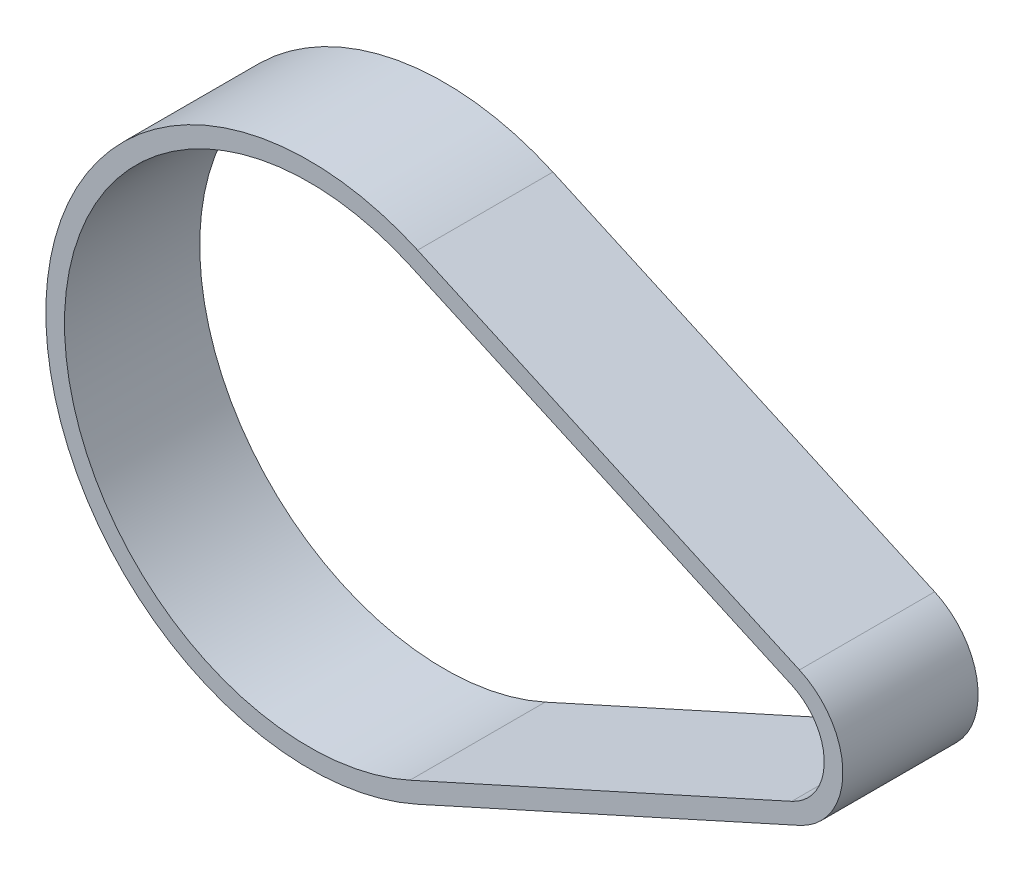
ISO-10303-21;
HEADER;
FILE_DESCRIPTION(('STEP AP214'),'2;1');
FILE_NAME('part.step','',(''),(''),'','','');
FILE_SCHEMA(('AUTOMOTIVE_DESIGN { 1 0 10303 214 1 1 1 1 }'));
ENDSEC;
DATA;
#1=APPLICATION_CONTEXT('core data for automotive mechanical design processes');
#2=APPLICATION_PROTOCOL_DEFINITION('international standard','automotive_design',2000,#1);
#3=PRODUCT_CONTEXT('',#1,'mechanical');
#4=PRODUCT('Part','Part','',(#3));
#5=PRODUCT_RELATED_PRODUCT_CATEGORY('part','',(#4));
#6=PRODUCT_DEFINITION_FORMATION('','',#4);
#7=PRODUCT_DEFINITION_CONTEXT('part definition',#1,'design');
#8=PRODUCT_DEFINITION('design','',#6,#7);
#9=PRODUCT_DEFINITION_SHAPE('','',#8);
#10=(LENGTH_UNIT() NAMED_UNIT(*) SI_UNIT(.MILLI.,.METRE.));
#11=(NAMED_UNIT(*) PLANE_ANGLE_UNIT() SI_UNIT($,.RADIAN.));
#12=(NAMED_UNIT(*) SI_UNIT($,.STERADIAN.) SOLID_ANGLE_UNIT());
#13=UNCERTAINTY_MEASURE_WITH_UNIT(LENGTH_MEASURE(1.E-05),#10,'distance_accuracy_value','');
#14=(GEOMETRIC_REPRESENTATION_CONTEXT(3) GLOBAL_UNCERTAINTY_ASSIGNED_CONTEXT((#13)) GLOBAL_UNIT_ASSIGNED_CONTEXT((#10,
#11,#12)) REPRESENTATION_CONTEXT('',''));
#15=CARTESIAN_POINT('',(0.,0.,0.));
#16=DIRECTION('',(0.,0.,1.));
#17=DIRECTION('',(1.,0.,0.));
#18=AXIS2_PLACEMENT_3D('',#15,#16,#17);
#19=CARTESIAN_POINT('',(34.,0.,-10.));
#20=DIRECTION('',(0.,0.,1.));
#21=DIRECTION('',(1.,0.,0.));
#22=AXIS2_PLACEMENT_3D('',#19,#20,#21);
#23=CYLINDRICAL_SURFACE('',#22,5.463458);
#24=CARTESIAN_POINT('',(34.,0.,0.));
#25=DIRECTION('',(0.,0.,1.));
#26=DIRECTION('',(1.,0.,0.));
#27=AXIS2_PLACEMENT_3D('',#24,#25,#26);
#28=CIRCLE('',#27,5.463458);
#29=CARTESIAN_POINT('',(36.2505646642891,-4.97838648656542,0.));
#30=VERTEX_POINT('',#29);
#31=CARTESIAN_POINT('',(36.2505646642891,4.97838648656543,0.));
#32=VERTEX_POINT('',#31);
#33=EDGE_CURVE('E131',#30,#32,#28,.T.);
#34=ORIENTED_EDGE('',*,*,#33,.F.);
#35=DIRECTION('',(0.,0.,1.));
#36=VECTOR('',#35,1.);
#37=CARTESIAN_POINT('',(36.2505646642891,-4.97838648656542,-10.));
#38=LINE('',#37,#36);
#39=CARTESIAN_POINT('',(36.2505646642891,-4.97838648656542,-10.));
#40=VERTEX_POINT('',#39);
#41=EDGE_CURVE('E11',#40,#30,#38,.T.);
#42=ORIENTED_EDGE('',*,*,#41,.F.);
#43=CARTESIAN_POINT('',(34.,0.,-10.));
#44=DIRECTION('',(0.,0.,1.));
#45=DIRECTION('',(1.,0.,0.));
#46=AXIS2_PLACEMENT_3D('',#43,#44,#45);
#47=CIRCLE('',#46,5.463458);
#48=CARTESIAN_POINT('',(36.2505646642891,4.97838648656543,-10.));
#49=VERTEX_POINT('',#48);
#50=EDGE_CURVE('E135',#40,#49,#47,.T.);
#51=ORIENTED_EDGE('',*,*,#50,.T.);
#52=DIRECTION('',(0.,0.,1.));
#53=VECTOR('',#52,1.);
#54=CARTESIAN_POINT('',(36.2505646642891,4.97838648656543,-10.));
#55=LINE('',#54,#53);
#56=EDGE_CURVE('E36',#49,#32,#55,.T.);
#57=ORIENTED_EDGE('',*,*,#56,.T.);
#58=EDGE_LOOP('',(#34,#42,#51,#57));
#59=FACE_BOUND('',#58,.T.);
#60=ADVANCED_FACE('F33',(#59),#23,.T.);
#61=CARTESIAN_POINT('',(36.2505646642891,-4.97838648656542,-10.));
#62=DIRECTION('',(0.41193044117647,-0.911215293787455,0.));
#63=DIRECTION('',(0.911215293787455,0.41193044117647,0.));
#64=AXIS2_PLACEMENT_3D('',#61,#62,#63);
#65=PLANE('',#64);
#66=DIRECTION('',(0.911215293787455,0.41193044117647,0.));
#67=VECTOR('',#66,1.);
#68=CARTESIAN_POINT('',(36.2505646642891,-4.97838648656542,0.));
#69=LINE('',#68,#67);
#70=CARTESIAN_POINT('',(8.01991206879573,-17.7405352977703,0.));
#71=VERTEX_POINT('',#70);
#72=EDGE_CURVE('E139',#71,#30,#69,.T.);
#73=ORIENTED_EDGE('',*,*,#72,.F.);
#74=DIRECTION('',(0.,0.,1.));
#75=VECTOR('',#74,1.);
#76=CARTESIAN_POINT('',(8.01991206879573,-17.7405352977703,-10.));
#77=LINE('',#76,#75);
#78=CARTESIAN_POINT('',(8.01991206879573,-17.7405352977703,-10.));
#79=VERTEX_POINT('',#78);
#80=EDGE_CURVE('E41',#79,#71,#77,.T.);
#81=ORIENTED_EDGE('',*,*,#80,.F.);
#82=DIRECTION('',(0.911215293787455,0.41193044117647,0.));
#83=VECTOR('',#82,1.);
#84=CARTESIAN_POINT('',(36.2505646642891,-4.97838648656542,-10.));
#85=LINE('',#84,#83);
#86=EDGE_CURVE('E145',#79,#40,#85,.T.);
#87=ORIENTED_EDGE('',*,*,#86,.T.);
#88=ORIENTED_EDGE('',*,*,#41,.T.);
#89=EDGE_LOOP('',(#73,#81,#87,#88));
#90=FACE_BOUND('',#89,.T.);
#91=ADVANCED_FACE('F171',(#90),#65,.T.);
#92=CARTESIAN_POINT('',(0.,0.,-10.));
#93=DIRECTION('',(0.,0.,1.));
#94=DIRECTION('',(1.,0.,0.));
#95=AXIS2_PLACEMENT_3D('',#92,#93,#94);
#96=CYLINDRICAL_SURFACE('',#95,19.469093);
#97=CARTESIAN_POINT('',(0.,0.,0.));
#98=DIRECTION('',(0.,0.,1.));
#99=DIRECTION('',(1.,0.,0.));
#100=AXIS2_PLACEMENT_3D('',#97,#98,#99);
#101=CIRCLE('',#100,19.469093);
#102=CARTESIAN_POINT('',(8.01991206879573,17.7405352977703,0.));
#103=VERTEX_POINT('',#102);
#104=EDGE_CURVE('E153',#103,#71,#101,.T.);
#105=ORIENTED_EDGE('',*,*,#104,.F.);
#106=DIRECTION('',(0.,0.,1.));
#107=VECTOR('',#106,1.);
#108=CARTESIAN_POINT('',(8.01991206879573,17.7405352977703,-10.));
#109=LINE('',#108,#107);
#110=CARTESIAN_POINT('',(8.01991206879573,17.7405352977703,-10.));
#111=VERTEX_POINT('',#110);
#112=EDGE_CURVE('E158',#111,#103,#109,.T.);
#113=ORIENTED_EDGE('',*,*,#112,.F.);
#114=CARTESIAN_POINT('',(0.,0.,-10.));
#115=DIRECTION('',(0.,0.,1.));
#116=DIRECTION('',(1.,0.,0.));
#117=AXIS2_PLACEMENT_3D('',#114,#115,#116);
#118=CIRCLE('',#117,19.469093);
#119=EDGE_CURVE('E142',#111,#79,#118,.T.);
#120=ORIENTED_EDGE('',*,*,#119,.T.);
#121=ORIENTED_EDGE('',*,*,#80,.T.);
#122=EDGE_LOOP('',(#105,#113,#120,#121));
#123=FACE_BOUND('',#122,.T.);
#124=ADVANCED_FACE('F175',(#123),#96,.T.);
#125=CARTESIAN_POINT('',(8.01991206879573,17.7405352977703,-10.));
#126=DIRECTION('',(0.41193044117647,0.911215293787455,0.));
#127=DIRECTION('',(-0.911215293787455,0.41193044117647,0.));
#128=AXIS2_PLACEMENT_3D('',#125,#126,#127);
#129=PLANE('',#128);
#130=DIRECTION('',(-0.911215293787455,0.41193044117647,0.));
#131=VECTOR('',#130,1.);
#132=CARTESIAN_POINT('',(8.01991206879573,17.7405352977703,0.));
#133=LINE('',#132,#131);
#134=EDGE_CURVE('E150',#32,#103,#133,.T.);
#135=ORIENTED_EDGE('',*,*,#134,.F.);
#136=ORIENTED_EDGE('',*,*,#56,.F.);
#137=DIRECTION('',(-0.911215293787455,0.41193044117647,0.));
#138=VECTOR('',#137,1.);
#139=CARTESIAN_POINT('',(8.01991206879573,17.7405352977703,-10.));
#140=LINE('',#139,#138);
#141=EDGE_CURVE('E138',#49,#111,#140,.T.);
#142=ORIENTED_EDGE('',*,*,#141,.T.);
#143=ORIENTED_EDGE('',*,*,#112,.T.);
#144=EDGE_LOOP('',(#135,#136,#142,#143));
#145=FACE_BOUND('',#144,.T.);
#146=ADVANCED_FACE('F166',(#145),#129,.T.);
#147=CARTESIAN_POINT('',(34.,0.,-10.));
#148=DIRECTION('',(0.,0.,1.));
#149=DIRECTION('',(1.,0.,0.));
#150=AXIS2_PLACEMENT_3D('',#147,#148,#149);
#151=PLANE('',#150);
#152=DIRECTION('',(-0.911215293787455,0.41193044117647,0.));
#153=VECTOR('',#152,1.);
#154=CARTESIAN_POINT('',(7.4514480599722,16.4830581923436,-10.));
#155=LINE('',#154,#153);
#156=CARTESIAN_POINT('',(35.6821006554656,3.72090938113874,-10.));
#157=VERTEX_POINT('',#156);
#158=CARTESIAN_POINT('',(7.4514480599722,16.4830581923436,-10.));
#159=VERTEX_POINT('',#158);
#160=EDGE_CURVE('E106',#157,#159,#155,.T.);
#161=ORIENTED_EDGE('',*,*,#160,.T.);
#162=CARTESIAN_POINT('',(0.,0.,-10.));
#163=DIRECTION('',(0.,0.,1.));
#164=DIRECTION('',(1.,0.,0.));
#165=AXIS2_PLACEMENT_3D('',#162,#163,#164);
#166=CIRCLE('',#165,18.089093);
#167=CARTESIAN_POINT('',(7.4514480599722,-16.4830581923436,-10.));
#168=VERTEX_POINT('',#167);
#169=EDGE_CURVE('E100',#159,#168,#166,.T.);
#170=ORIENTED_EDGE('',*,*,#169,.T.);
#171=DIRECTION('',(0.911215293787455,0.411930441176471,0.));
#172=VECTOR('',#171,1.);
#173=CARTESIAN_POINT('',(35.6821006554656,-3.72090938113873,-10.));
#174=LINE('',#173,#172);
#175=CARTESIAN_POINT('',(35.6821006554656,-3.72090938113873,-10.));
#176=VERTEX_POINT('',#175);
#177=EDGE_CURVE('E109',#168,#176,#174,.T.);
#178=ORIENTED_EDGE('',*,*,#177,.T.);
#179=CARTESIAN_POINT('',(34.,0.,-10.));
#180=DIRECTION('',(0.,0.,1.));
#181=DIRECTION('',(1.,0.,0.));
#182=AXIS2_PLACEMENT_3D('',#179,#180,#181);
#183=CIRCLE('',#182,4.083458);
#184=EDGE_CURVE('E49',#176,#157,#183,.T.);
#185=ORIENTED_EDGE('',*,*,#184,.T.);
#186=EDGE_LOOP('',(#161,#170,#178,#185));
#187=FACE_BOUND('',#186,.T.);
#188=ORIENTED_EDGE('',*,*,#50,.F.);
#189=ORIENTED_EDGE('',*,*,#86,.F.);
#190=ORIENTED_EDGE('',*,*,#119,.F.);
#191=ORIENTED_EDGE('',*,*,#141,.F.);
#192=EDGE_LOOP('',(#188,#189,#190,#191));
#193=FACE_BOUND('',#192,.T.);
#194=ADVANCED_FACE('F113',(#187,#193),#151,.F.);
#195=CARTESIAN_POINT('',(34.,0.,0.));
#196=DIRECTION('',(0.,0.,1.));
#197=DIRECTION('',(1.,0.,0.));
#198=AXIS2_PLACEMENT_3D('',#195,#196,#197);
#199=PLANE('',#198);
#200=CARTESIAN_POINT('',(0.,0.,0.));
#201=DIRECTION('',(0.,0.,1.));
#202=DIRECTION('',(1.,0.,0.));
#203=AXIS2_PLACEMENT_3D('',#200,#201,#202);
#204=CIRCLE('',#203,18.089093);
#205=CARTESIAN_POINT('',(7.4514480599722,16.4830581923436,0.));
#206=VERTEX_POINT('',#205);
#207=CARTESIAN_POINT('',(7.4514480599722,-16.4830581923436,0.));
#208=VERTEX_POINT('',#207);
#209=EDGE_CURVE('E57',#206,#208,#204,.T.);
#210=ORIENTED_EDGE('',*,*,#209,.F.);
#211=DIRECTION('',(-0.911215293787455,0.41193044117647,0.));
#212=VECTOR('',#211,1.);
#213=CARTESIAN_POINT('',(7.4514480599722,16.4830581923436,0.));
#214=LINE('',#213,#212);
#215=CARTESIAN_POINT('',(35.6821006554656,3.72090938113874,0.));
#216=VERTEX_POINT('',#215);
#217=EDGE_CURVE('E116',#216,#206,#214,.T.);
#218=ORIENTED_EDGE('',*,*,#217,.F.);
#219=CARTESIAN_POINT('',(34.,0.,0.));
#220=DIRECTION('',(0.,0.,1.));
#221=DIRECTION('',(1.,0.,0.));
#222=AXIS2_PLACEMENT_3D('',#219,#220,#221);
#223=CIRCLE('',#222,4.083458);
#224=CARTESIAN_POINT('',(35.6821006554656,-3.72090938113874,0.));
#225=VERTEX_POINT('',#224);
#226=EDGE_CURVE('E119',#225,#216,#223,.T.);
#227=ORIENTED_EDGE('',*,*,#226,.F.);
#228=DIRECTION('',(0.911215293787455,0.411930441176471,0.));
#229=VECTOR('',#228,1.);
#230=CARTESIAN_POINT('',(35.6821006554656,-3.72090938113873,0.));
#231=LINE('',#230,#229);
#232=EDGE_CURVE('E125',#208,#225,#231,.T.);
#233=ORIENTED_EDGE('',*,*,#232,.F.);
#234=EDGE_LOOP('',(#210,#218,#227,#233));
#235=FACE_BOUND('',#234,.T.);
#236=ORIENTED_EDGE('',*,*,#33,.T.);
#237=ORIENTED_EDGE('',*,*,#134,.T.);
#238=ORIENTED_EDGE('',*,*,#104,.T.);
#239=ORIENTED_EDGE('',*,*,#72,.T.);
#240=EDGE_LOOP('',(#236,#237,#238,#239));
#241=FACE_BOUND('',#240,.T.);
#242=ADVANCED_FACE('F168',(#235,#241),#199,.T.);
#243=CARTESIAN_POINT('',(0.,0.,-10.));
#244=DIRECTION('',(0.,0.,1.));
#245=DIRECTION('',(1.,0.,0.));
#246=AXIS2_PLACEMENT_3D('',#243,#244,#245);
#247=CYLINDRICAL_SURFACE('',#246,18.089093);
#248=ORIENTED_EDGE('',*,*,#209,.T.);
#249=DIRECTION('',(0.,0.,1.));
#250=VECTOR('',#249,1.);
#251=CARTESIAN_POINT('',(7.4514480599722,-16.4830581923436,-10.));
#252=LINE('',#251,#250);
#253=EDGE_CURVE('E96',#168,#208,#252,.T.);
#254=ORIENTED_EDGE('',*,*,#253,.F.);
#255=ORIENTED_EDGE('',*,*,#169,.F.);
#256=DIRECTION('',(0.,0.,1.));
#257=VECTOR('',#256,1.);
#258=CARTESIAN_POINT('',(7.4514480599722,16.4830581923436,-10.));
#259=LINE('',#258,#257);
#260=EDGE_CURVE('E129',#159,#206,#259,.T.);
#261=ORIENTED_EDGE('',*,*,#260,.T.);
#262=EDGE_LOOP('',(#248,#254,#255,#261));
#263=FACE_BOUND('',#262,.T.);
#264=ADVANCED_FACE('F98',(#263),#247,.F.);
#265=CARTESIAN_POINT('',(7.4514480599722,16.4830581923436,-10.));
#266=DIRECTION('',(0.41193044117647,0.911215293787455,0.));
#267=DIRECTION('',(-0.911215293787455,0.41193044117647,0.));
#268=AXIS2_PLACEMENT_3D('',#265,#266,#267);
#269=PLANE('',#268);
#270=ORIENTED_EDGE('',*,*,#217,.T.);
#271=ORIENTED_EDGE('',*,*,#260,.F.);
#272=ORIENTED_EDGE('',*,*,#160,.F.);
#273=DIRECTION('',(0.,0.,1.));
#274=VECTOR('',#273,1.);
#275=CARTESIAN_POINT('',(35.6821006554656,3.72090938113874,-10.));
#276=LINE('',#275,#274);
#277=EDGE_CURVE('E132',#157,#216,#276,.T.);
#278=ORIENTED_EDGE('',*,*,#277,.T.);
#279=EDGE_LOOP('',(#270,#271,#272,#278));
#280=FACE_BOUND('',#279,.T.);
#281=ADVANCED_FACE('F226',(#280),#269,.F.);
#282=CARTESIAN_POINT('',(34.,0.,-10.));
#283=DIRECTION('',(0.,0.,1.));
#284=DIRECTION('',(1.,0.,0.));
#285=AXIS2_PLACEMENT_3D('',#282,#283,#284);
#286=CYLINDRICAL_SURFACE('',#285,4.083458);
#287=ORIENTED_EDGE('',*,*,#226,.T.);
#288=ORIENTED_EDGE('',*,*,#277,.F.);
#289=ORIENTED_EDGE('',*,*,#184,.F.);
#290=DIRECTION('',(0.,0.,1.));
#291=VECTOR('',#290,1.);
#292=CARTESIAN_POINT('',(35.6821006554656,-3.72090938113874,-10.));
#293=LINE('',#292,#291);
#294=EDGE_CURVE('E105',#176,#225,#293,.T.);
#295=ORIENTED_EDGE('',*,*,#294,.T.);
#296=EDGE_LOOP('',(#287,#288,#289,#295));
#297=FACE_BOUND('',#296,.T.);
#298=ADVANCED_FACE('F235',(#297),#286,.F.);
#299=CARTESIAN_POINT('',(35.6821006554656,-3.72090938113873,-10.));
#300=DIRECTION('',(0.411930441176471,-0.911215293787455,0.));
#301=DIRECTION('',(0.911215293787455,0.411930441176471,0.));
#302=AXIS2_PLACEMENT_3D('',#299,#300,#301);
#303=PLANE('',#302);
#304=ORIENTED_EDGE('',*,*,#232,.T.);
#305=ORIENTED_EDGE('',*,*,#294,.F.);
#306=ORIENTED_EDGE('',*,*,#177,.F.);
#307=ORIENTED_EDGE('',*,*,#253,.T.);
#308=EDGE_LOOP('',(#304,#305,#306,#307));
#309=FACE_BOUND('',#308,.T.);
#310=ADVANCED_FACE('F110',(#309),#303,.F.);
#311=CLOSED_SHELL('',(#60,#91,#124,#146,#194,#242,#264,#281,#298,#310));
#312=MANIFOLD_SOLID_BREP('B2',#311);
#313=ADVANCED_BREP_SHAPE_REPRESENTATION('',(#18,#312),#14);
#314=SHAPE_DEFINITION_REPRESENTATION(#9,#313);
ENDSEC;
END-ISO-10303-21;
